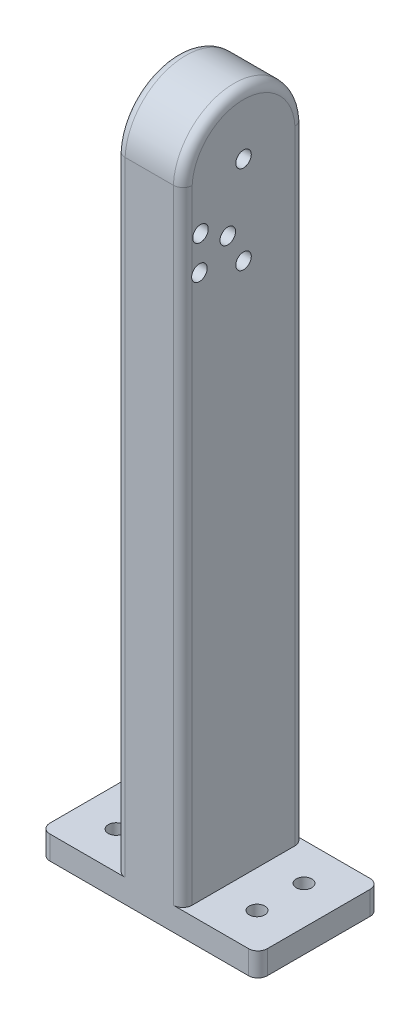
ISO-10303-21;
HEADER;
FILE_DESCRIPTION(('STEP AP214'),'2;1');
FILE_NAME('part.step','',(''),(''),'','','');
FILE_SCHEMA(('AUTOMOTIVE_DESIGN { 1 0 10303 214 1 1 1 1 }'));
ENDSEC;
DATA;
#1=APPLICATION_CONTEXT('core data for automotive mechanical design processes');
#2=APPLICATION_PROTOCOL_DEFINITION('international standard','automotive_design',2000,#1);
#3=PRODUCT_CONTEXT('',#1,'mechanical');
#4=PRODUCT('Part','Part','',(#3));
#5=PRODUCT_RELATED_PRODUCT_CATEGORY('part','',(#4));
#6=PRODUCT_DEFINITION_FORMATION('','',#4);
#7=PRODUCT_DEFINITION_CONTEXT('part definition',#1,'design');
#8=PRODUCT_DEFINITION('design','',#6,#7);
#9=PRODUCT_DEFINITION_SHAPE('','',#8);
#10=(LENGTH_UNIT() NAMED_UNIT(*) SI_UNIT(.MILLI.,.METRE.));
#11=(NAMED_UNIT(*) PLANE_ANGLE_UNIT() SI_UNIT($,.RADIAN.));
#12=(NAMED_UNIT(*) SI_UNIT($,.STERADIAN.) SOLID_ANGLE_UNIT());
#13=UNCERTAINTY_MEASURE_WITH_UNIT(LENGTH_MEASURE(1.E-05),#10,'distance_accuracy_value','');
#14=(GEOMETRIC_REPRESENTATION_CONTEXT(3) GLOBAL_UNCERTAINTY_ASSIGNED_CONTEXT((#13)) GLOBAL_UNIT_ASSIGNED_CONTEXT((#10,
#11,#12)) REPRESENTATION_CONTEXT('',''));
#15=CARTESIAN_POINT('',(0.,0.,0.));
#16=DIRECTION('',(0.,0.,1.));
#17=DIRECTION('',(1.,0.,0.));
#18=AXIS2_PLACEMENT_3D('',#15,#16,#17);
#19=CARTESIAN_POINT('',(-23.135,-31.95,9.56508032957828));
#20=DIRECTION('',(1.,0.,0.));
#21=DIRECTION('',(0.,0.,-1.));
#22=AXIS2_PLACEMENT_3D('',#19,#20,#21);
#23=CYLINDRICAL_SURFACE('',#22,12.95);
#24=DIRECTION('',(1.,0.,0.));
#25=VECTOR('',#24,1.);
#26=CARTESIAN_POINT('',(-23.135,-31.3252175420697,-3.36983934084343));
#27=LINE('',#26,#25);
#28=CARTESIAN_POINT('',(-5.135,-31.3252175420697,-3.36983934084343));
#29=VERTEX_POINT('',#28);
#30=CARTESIAN_POINT('',(5.135,-31.3252175420697,-3.36983934084343));
#31=VERTEX_POINT('',#30);
#32=EDGE_CURVE('E233',#29,#31,#27,.T.);
#33=ORIENTED_EDGE('',*,*,#32,.F.);
#34=CARTESIAN_POINT('',(-5.135,-31.95,9.56508032957828));
#35=DIRECTION('',(-1.,0.,0.));
#36=DIRECTION('',(0.,0.,1.));
#37=AXIS2_PLACEMENT_3D('',#34,#35,#36);
#38=CIRCLE('',#37,12.95);
#39=CARTESIAN_POINT('',(-5.135,-31.3252175420698,22.5));
#40=VERTEX_POINT('',#39);
#41=EDGE_CURVE('E446',#29,#40,#38,.F.);
#42=ORIENTED_EDGE('',*,*,#41,.T.);
#43=DIRECTION('',(1.,0.,0.));
#44=VECTOR('',#43,1.);
#45=CARTESIAN_POINT('',(-23.135,-31.3252175420698,22.5));
#46=LINE('',#45,#44);
#47=CARTESIAN_POINT('',(5.135,-31.3252175420698,22.5));
#48=VERTEX_POINT('',#47);
#49=EDGE_CURVE('E230',#40,#48,#46,.T.);
#50=ORIENTED_EDGE('',*,*,#49,.T.);
#51=CARTESIAN_POINT('',(5.135,-31.95,9.56508032957828));
#52=DIRECTION('',(-1.,0.,0.));
#53=DIRECTION('',(0.,0.,1.));
#54=AXIS2_PLACEMENT_3D('',#51,#52,#53);
#55=CIRCLE('',#54,12.95);
#56=EDGE_CURVE('E390',#48,#31,#55,.T.);
#57=ORIENTED_EDGE('',*,*,#56,.T.);
#58=EDGE_LOOP('',(#33,#42,#50,#57));
#59=FACE_BOUND('',#58,.T.);
#60=ADVANCED_FACE('F39',(#59),#23,.T.);
#61=CARTESIAN_POINT('',(-23.135,-169.,22.5));
#62=DIRECTION('',(0.,-1.,0.));
#63=DIRECTION('',(0.,0.,-1.));
#64=AXIS2_PLACEMENT_3D('',#61,#62,#63);
#65=PLANE('',#64);
#66=CARTESIAN_POINT('',(15.,-169.,4.56690316185003));
#67=DIRECTION('',(0.,1.,0.));
#68=DIRECTION('',(0.,0.,-1.));
#69=AXIS2_PLACEMENT_3D('',#66,#67,#68);
#70=CIRCLE('',#69,1.65);
#71=CARTESIAN_POINT('',(15.,-169.,2.91690316185003));
#72=VERTEX_POINT('',#71);
#73=EDGE_CURVE('E403',#72,#72,#70,.T.);
#74=ORIENTED_EDGE('',*,*,#73,.T.);
#75=EDGE_LOOP('',(#74));
#76=FACE_BOUND('',#75,.T.);
#77=CARTESIAN_POINT('',(15.,-169.,14.5632574973065));
#78=DIRECTION('',(0.,1.,0.));
#79=DIRECTION('',(0.,0.,1.));
#80=AXIS2_PLACEMENT_3D('',#77,#78,#79);
#81=CIRCLE('',#80,1.65);
#82=CARTESIAN_POINT('',(15.,-169.,16.2132574973065));
#83=VERTEX_POINT('',#82);
#84=EDGE_CURVE('E714',#83,#83,#81,.T.);
#85=ORIENTED_EDGE('',*,*,#84,.T.);
#86=EDGE_LOOP('',(#85));
#87=FACE_BOUND('',#86,.T.);
#88=CARTESIAN_POINT('',(-15.,-169.,14.5632574973065));
#89=DIRECTION('',(0.,1.,0.));
#90=DIRECTION('',(0.,0.,-1.));
#91=AXIS2_PLACEMENT_3D('',#88,#89,#90);
#92=CIRCLE('',#91,1.65);
#93=CARTESIAN_POINT('',(-15.,-169.,12.9132574973065));
#94=VERTEX_POINT('',#93);
#95=EDGE_CURVE('E705',#94,#94,#92,.T.);
#96=ORIENTED_EDGE('',*,*,#95,.T.);
#97=EDGE_LOOP('',(#96));
#98=FACE_BOUND('',#97,.T.);
#99=CARTESIAN_POINT('',(-15.,-169.,4.56690316185003));
#100=DIRECTION('',(0.,1.,0.));
#101=DIRECTION('',(0.,0.,1.));
#102=AXIS2_PLACEMENT_3D('',#99,#100,#101);
#103=CIRCLE('',#102,1.65);
#104=CARTESIAN_POINT('',(-15.,-169.,6.21690316185003));
#105=VERTEX_POINT('',#104);
#106=EDGE_CURVE('E392',#105,#105,#103,.T.);
#107=ORIENTED_EDGE('',*,*,#106,.T.);
#108=EDGE_LOOP('',(#107));
#109=FACE_BOUND('',#108,.T.);
#110=DIRECTION('',(1.,0.,0.));
#111=VECTOR('',#110,1.);
#112=CARTESIAN_POINT('',(-23.135,-169.,-3.36983934084343));
#113=LINE('',#112,#111);
#114=CARTESIAN_POINT('',(-21.135,-169.,-3.36983934084343));
#115=VERTEX_POINT('',#114);
#116=CARTESIAN_POINT('',(21.135,-169.,-3.36983934084343));
#117=VERTEX_POINT('',#116);
#118=EDGE_CURVE('E225',#115,#117,#113,.T.);
#119=ORIENTED_EDGE('',*,*,#118,.T.);
#120=CARTESIAN_POINT('',(21.135,-169.,-1.36983934084343));
#121=DIRECTION('',(0.,-1.,0.));
#122=DIRECTION('',(0.,0.,-1.));
#123=AXIS2_PLACEMENT_3D('',#120,#121,#122);
#124=CIRCLE('',#123,2.);
#125=CARTESIAN_POINT('',(23.135,-169.,-1.36983934084343));
#126=VERTEX_POINT('',#125);
#127=EDGE_CURVE('E254',#117,#126,#124,.T.);
#128=ORIENTED_EDGE('',*,*,#127,.T.);
#129=DIRECTION('',(0.,0.,-1.));
#130=VECTOR('',#129,1.);
#131=CARTESIAN_POINT('',(23.135,-169.,22.5));
#132=LINE('',#131,#130);
#133=CARTESIAN_POINT('',(23.135,-169.,20.5));
#134=VERTEX_POINT('',#133);
#135=EDGE_CURVE('E191',#134,#126,#132,.T.);
#136=ORIENTED_EDGE('',*,*,#135,.F.);
#137=CARTESIAN_POINT('',(21.135,-169.,20.5));
#138=DIRECTION('',(0.,-1.,0.));
#139=DIRECTION('',(0.,0.,-1.));
#140=AXIS2_PLACEMENT_3D('',#137,#138,#139);
#141=CIRCLE('',#140,2.);
#142=CARTESIAN_POINT('',(21.135,-169.,22.5));
#143=VERTEX_POINT('',#142);
#144=EDGE_CURVE('E250',#134,#143,#141,.T.);
#145=ORIENTED_EDGE('',*,*,#144,.T.);
#146=DIRECTION('',(1.,0.,0.));
#147=VECTOR('',#146,1.);
#148=CARTESIAN_POINT('',(-23.135,-169.,22.5));
#149=LINE('',#148,#147);
#150=CARTESIAN_POINT('',(-21.135,-169.,22.5));
#151=VERTEX_POINT('',#150);
#152=EDGE_CURVE('E227',#151,#143,#149,.T.);
#153=ORIENTED_EDGE('',*,*,#152,.F.);
#154=CARTESIAN_POINT('',(-21.135,-169.,20.5));
#155=DIRECTION('',(0.,-1.,0.));
#156=DIRECTION('',(0.,0.,-1.));
#157=AXIS2_PLACEMENT_3D('',#154,#155,#156);
#158=CIRCLE('',#157,2.);
#159=CARTESIAN_POINT('',(-23.135,-169.,20.5));
#160=VERTEX_POINT('',#159);
#161=EDGE_CURVE('E248',#151,#160,#158,.T.);
#162=ORIENTED_EDGE('',*,*,#161,.T.);
#163=DIRECTION('',(0.,0.,-1.));
#164=VECTOR('',#163,1.);
#165=CARTESIAN_POINT('',(-23.135,-169.,22.5));
#166=LINE('',#165,#164);
#167=CARTESIAN_POINT('',(-23.135,-169.,-1.36983934084343));
#168=VERTEX_POINT('',#167);
#169=EDGE_CURVE('E222',#160,#168,#166,.T.);
#170=ORIENTED_EDGE('',*,*,#169,.T.);
#171=CARTESIAN_POINT('',(-21.135,-169.,-1.36983934084343));
#172=DIRECTION('',(0.,-1.,0.));
#173=DIRECTION('',(0.,0.,-1.));
#174=AXIS2_PLACEMENT_3D('',#171,#172,#173);
#175=CIRCLE('',#174,2.);
#176=EDGE_CURVE('E252',#168,#115,#175,.T.);
#177=ORIENTED_EDGE('',*,*,#176,.T.);
#178=EDGE_LOOP('',(#119,#128,#136,#145,#153,#162,#170,#177));
#179=FACE_BOUND('',#178,.T.);
#180=ADVANCED_FACE('F319',(#76,#87,#98,#109,#179),#65,.T.);
#181=CARTESIAN_POINT('',(-23.135,-31.3252175420698,22.5));
#182=DIRECTION('',(0.,0.,1.));
#183=DIRECTION('',(1.,0.,0.));
#184=AXIS2_PLACEMENT_3D('',#181,#182,#183);
#185=PLANE('',#184);
#186=ORIENTED_EDGE('',*,*,#49,.F.);
#187=DIRECTION('',(0.,1.,0.));
#188=VECTOR('',#187,1.);
#189=CARTESIAN_POINT('',(-5.135,-31.3252175420698,22.5));
#190=LINE('',#189,#188);
#191=CARTESIAN_POINT('',(-5.135,-164.,22.5));
#192=VERTEX_POINT('',#191);
#193=EDGE_CURVE('E443',#40,#192,#190,.F.);
#194=ORIENTED_EDGE('',*,*,#193,.T.);
#195=DIRECTION('',(-1.,0.,0.));
#196=VECTOR('',#195,1.);
#197=CARTESIAN_POINT('',(-7.135,-164.,22.5));
#198=LINE('',#197,#196);
#199=CARTESIAN_POINT('',(-21.135,-164.,22.5));
#200=VERTEX_POINT('',#199);
#201=EDGE_CURVE('E217',#192,#200,#198,.T.);
#202=ORIENTED_EDGE('',*,*,#201,.T.);
#203=DIRECTION('',(0.,-1.,0.));
#204=VECTOR('',#203,1.);
#205=CARTESIAN_POINT('',(-21.135,-169.,22.5));
#206=LINE('',#205,#204);
#207=EDGE_CURVE('E479',#200,#151,#206,.T.);
#208=ORIENTED_EDGE('',*,*,#207,.T.);
#209=ORIENTED_EDGE('',*,*,#152,.T.);
#210=DIRECTION('',(0.,-1.,0.));
#211=VECTOR('',#210,1.);
#212=CARTESIAN_POINT('',(21.135,-31.3252175420698,22.5));
#213=LINE('',#212,#211);
#214=CARTESIAN_POINT('',(21.135,-164.,22.5));
#215=VERTEX_POINT('',#214);
#216=EDGE_CURVE('E478',#143,#215,#213,.F.);
#217=ORIENTED_EDGE('',*,*,#216,.T.);
#218=DIRECTION('',(-1.,0.,0.));
#219=VECTOR('',#218,1.);
#220=CARTESIAN_POINT('',(23.135,-164.,22.5));
#221=LINE('',#220,#219);
#222=CARTESIAN_POINT('',(5.135,-164.,22.5));
#223=VERTEX_POINT('',#222);
#224=EDGE_CURVE('E197',#215,#223,#221,.T.);
#225=ORIENTED_EDGE('',*,*,#224,.T.);
#226=DIRECTION('',(0.,-1.,0.));
#227=VECTOR('',#226,1.);
#228=CARTESIAN_POINT('',(5.135,-31.3252175420698,22.5));
#229=LINE('',#228,#227);
#230=EDGE_CURVE('E476',#223,#48,#229,.F.);
#231=ORIENTED_EDGE('',*,*,#230,.T.);
#232=EDGE_LOOP('',(#186,#194,#202,#208,#209,#217,#225,#231));
#233=FACE_BOUND('',#232,.T.);
#234=ADVANCED_FACE('F316',(#233),#185,.T.);
#235=CARTESIAN_POINT('',(-23.135,-169.,-3.36983934084343));
#236=DIRECTION('',(0.,0.,-1.));
#237=DIRECTION('',(-1.,0.,0.));
#238=AXIS2_PLACEMENT_3D('',#235,#236,#237);
#239=PLANE('',#238);
#240=DIRECTION('',(1.,0.,0.));
#241=VECTOR('',#240,1.);
#242=CARTESIAN_POINT('',(7.135,-164.,-3.36983934084344));
#243=LINE('',#242,#241);
#244=CARTESIAN_POINT('',(5.135,-164.,-3.36983934084344));
#245=VERTEX_POINT('',#244);
#246=CARTESIAN_POINT('',(21.135,-164.,-3.36983934084344));
#247=VERTEX_POINT('',#246);
#248=EDGE_CURVE('E208',#245,#247,#243,.T.);
#249=ORIENTED_EDGE('',*,*,#248,.T.);
#250=DIRECTION('',(0.,1.,0.));
#251=VECTOR('',#250,1.);
#252=CARTESIAN_POINT('',(21.135,-169.,-3.36983934084343));
#253=LINE('',#252,#251);
#254=EDGE_CURVE('E176',#247,#117,#253,.F.);
#255=ORIENTED_EDGE('',*,*,#254,.T.);
#256=ORIENTED_EDGE('',*,*,#118,.F.);
#257=DIRECTION('',(0.,1.,0.));
#258=VECTOR('',#257,1.);
#259=CARTESIAN_POINT('',(-21.135,-164.,-3.36983934084343));
#260=LINE('',#259,#258);
#261=CARTESIAN_POINT('',(-21.135,-164.,-3.36983934084344));
#262=VERTEX_POINT('',#261);
#263=EDGE_CURVE('E242',#115,#262,#260,.T.);
#264=ORIENTED_EDGE('',*,*,#263,.T.);
#265=DIRECTION('',(-1.,0.,0.));
#266=VECTOR('',#265,1.);
#267=CARTESIAN_POINT('',(-7.135,-164.,-3.36983934084344));
#268=LINE('',#267,#266);
#269=CARTESIAN_POINT('',(-5.135,-164.,-3.36983934084343));
#270=VERTEX_POINT('',#269);
#271=EDGE_CURVE('E214',#270,#262,#268,.T.);
#272=ORIENTED_EDGE('',*,*,#271,.F.);
#273=DIRECTION('',(0.,-1.,0.));
#274=VECTOR('',#273,1.);
#275=CARTESIAN_POINT('',(-5.135,-169.,-3.36983934084343));
#276=LINE('',#275,#274);
#277=EDGE_CURVE('E245',#270,#29,#276,.F.);
#278=ORIENTED_EDGE('',*,*,#277,.T.);
#279=ORIENTED_EDGE('',*,*,#32,.T.);
#280=DIRECTION('',(0.,-1.,0.));
#281=VECTOR('',#280,1.);
#282=CARTESIAN_POINT('',(5.135,-164.,-3.36983934084343));
#283=LINE('',#282,#281);
#284=EDGE_CURVE('E180',#31,#245,#283,.T.);
#285=ORIENTED_EDGE('',*,*,#284,.T.);
#286=EDGE_LOOP('',(#249,#255,#256,#264,#272,#278,#279,#285));
#287=FACE_BOUND('',#286,.T.);
#288=ADVANCED_FACE('F312',(#287),#239,.T.);
#289=CARTESIAN_POINT('',(-23.135,-31.95,9.56508032957828));
#290=DIRECTION('',(1.,0.,0.));
#291=DIRECTION('',(0.,0.,-1.));
#292=AXIS2_PLACEMENT_3D('',#289,#290,#291);
#293=PLANE('',#292);
#294=DIRECTION('',(0.,0.,1.));
#295=VECTOR('',#294,1.);
#296=CARTESIAN_POINT('',(-23.135,-164.,-3.36983934084344));
#297=LINE('',#296,#295);
#298=CARTESIAN_POINT('',(-23.135,-164.,-1.36983934084343));
#299=VERTEX_POINT('',#298);
#300=CARTESIAN_POINT('',(-23.135,-164.,20.5));
#301=VERTEX_POINT('',#300);
#302=EDGE_CURVE('E210',#299,#301,#297,.T.);
#303=ORIENTED_EDGE('',*,*,#302,.F.);
#304=DIRECTION('',(0.,1.,0.));
#305=VECTOR('',#304,1.);
#306=CARTESIAN_POINT('',(-23.135,-169.,-1.36983934084343));
#307=LINE('',#306,#305);
#308=EDGE_CURVE('E465',#299,#168,#307,.F.);
#309=ORIENTED_EDGE('',*,*,#308,.T.);
#310=ORIENTED_EDGE('',*,*,#169,.F.);
#311=DIRECTION('',(0.,-1.,0.));
#312=VECTOR('',#311,1.);
#313=CARTESIAN_POINT('',(-23.135,-164.,20.5));
#314=LINE('',#313,#312);
#315=EDGE_CURVE('E467',#160,#301,#314,.F.);
#316=ORIENTED_EDGE('',*,*,#315,.T.);
#317=EDGE_LOOP('',(#303,#309,#310,#316));
#318=FACE_BOUND('',#317,.T.);
#319=ADVANCED_FACE('F309',(#318),#293,.F.);
#320=CARTESIAN_POINT('',(23.135,-31.95,9.56508032957828));
#321=DIRECTION('',(1.,0.,0.));
#322=DIRECTION('',(0.,0.,-1.));
#323=AXIS2_PLACEMENT_3D('',#320,#321,#322);
#324=PLANE('',#323);
#325=ORIENTED_EDGE('',*,*,#135,.T.);
#326=DIRECTION('',(0.,1.,0.));
#327=VECTOR('',#326,1.);
#328=CARTESIAN_POINT('',(23.135,-31.95,-1.36983934084343));
#329=LINE('',#328,#327);
#330=CARTESIAN_POINT('',(23.135,-164.,-1.36983934084343));
#331=VERTEX_POINT('',#330);
#332=EDGE_CURVE('E175',#126,#331,#329,.T.);
#333=ORIENTED_EDGE('',*,*,#332,.T.);
#334=DIRECTION('',(0.,0.,1.));
#335=VECTOR('',#334,1.);
#336=CARTESIAN_POINT('',(23.135,-164.,-3.36983934084344));
#337=LINE('',#336,#335);
#338=CARTESIAN_POINT('',(23.135,-164.,20.5));
#339=VERTEX_POINT('',#338);
#340=EDGE_CURVE('E188',#331,#339,#337,.T.);
#341=ORIENTED_EDGE('',*,*,#340,.T.);
#342=DIRECTION('',(0.,-1.,0.));
#343=VECTOR('',#342,1.);
#344=CARTESIAN_POINT('',(23.135,-31.95,20.5));
#345=LINE('',#344,#343);
#346=EDGE_CURVE('E192',#339,#134,#345,.T.);
#347=ORIENTED_EDGE('',*,*,#346,.T.);
#348=EDGE_LOOP('',(#325,#333,#341,#347));
#349=FACE_BOUND('',#348,.T.);
#350=ADVANCED_FACE('F186',(#349),#324,.T.);
#351=CARTESIAN_POINT('',(-7.135,-164.,-3.36983934084344));
#352=DIRECTION('',(0.,-1.,0.));
#353=DIRECTION('',(0.,0.,-1.));
#354=AXIS2_PLACEMENT_3D('',#351,#352,#353);
#355=PLANE('',#354);
#356=CARTESIAN_POINT('',(-15.,-164.,14.5632574973065));
#357=DIRECTION('',(0.,1.,0.));
#358=DIRECTION('',(0.,0.,-1.));
#359=AXIS2_PLACEMENT_3D('',#356,#357,#358);
#360=CIRCLE('',#359,1.65);
#361=CARTESIAN_POINT('',(-15.,-164.,12.9132574973065));
#362=VERTEX_POINT('',#361);
#363=EDGE_CURVE('E400',#362,#362,#360,.T.);
#364=ORIENTED_EDGE('',*,*,#363,.F.);
#365=EDGE_LOOP('',(#364));
#366=FACE_BOUND('',#365,.T.);
#367=CARTESIAN_POINT('',(-15.,-164.,4.56690316185003));
#368=DIRECTION('',(0.,1.,0.));
#369=DIRECTION('',(0.,0.,1.));
#370=AXIS2_PLACEMENT_3D('',#367,#368,#369);
#371=CIRCLE('',#370,1.65);
#372=CARTESIAN_POINT('',(-15.,-164.,6.21690316185003));
#373=VERTEX_POINT('',#372);
#374=EDGE_CURVE('E395',#373,#373,#371,.T.);
#375=ORIENTED_EDGE('',*,*,#374,.F.);
#376=EDGE_LOOP('',(#375));
#377=FACE_BOUND('',#376,.T.);
#378=ORIENTED_EDGE('',*,*,#271,.T.);
#379=CARTESIAN_POINT('',(-21.135,-164.,-1.36983934084343));
#380=DIRECTION('',(0.,-1.,0.));
#381=DIRECTION('',(0.,0.,-1.));
#382=AXIS2_PLACEMENT_3D('',#379,#380,#381);
#383=CIRCLE('',#382,2.);
#384=EDGE_CURVE('E469',#262,#299,#383,.F.);
#385=ORIENTED_EDGE('',*,*,#384,.T.);
#386=ORIENTED_EDGE('',*,*,#302,.T.);
#387=CARTESIAN_POINT('',(-21.135,-164.,20.5));
#388=DIRECTION('',(0.,-1.,0.));
#389=DIRECTION('',(0.,0.,-1.));
#390=AXIS2_PLACEMENT_3D('',#387,#388,#389);
#391=CIRCLE('',#390,2.);
#392=EDGE_CURVE('E471',#301,#200,#391,.F.);
#393=ORIENTED_EDGE('',*,*,#392,.T.);
#394=ORIENTED_EDGE('',*,*,#201,.F.);
#395=CARTESIAN_POINT('',(-5.135,-164.,20.5));
#396=DIRECTION('',(0.,-1.,0.));
#397=DIRECTION('',(0.,0.,-1.));
#398=AXIS2_PLACEMENT_3D('',#395,#396,#397);
#399=CIRCLE('',#398,2.);
#400=CARTESIAN_POINT('',(-7.135,-164.,20.5));
#401=VERTEX_POINT('',#400);
#402=EDGE_CURVE('E455',#192,#401,#399,.T.);
#403=ORIENTED_EDGE('',*,*,#402,.T.);
#404=DIRECTION('',(0.,0.,1.));
#405=VECTOR('',#404,1.);
#406=CARTESIAN_POINT('',(-7.135,-164.,-3.36983934084344));
#407=LINE('',#406,#405);
#408=CARTESIAN_POINT('',(-7.135,-164.,-1.36983934084343));
#409=VERTEX_POINT('',#408);
#410=EDGE_CURVE('E211',#409,#401,#407,.T.);
#411=ORIENTED_EDGE('',*,*,#410,.F.);
#412=CARTESIAN_POINT('',(-5.135,-164.,-1.36983934084343));
#413=DIRECTION('',(0.,-1.,0.));
#414=DIRECTION('',(0.,0.,-1.));
#415=AXIS2_PLACEMENT_3D('',#412,#413,#414);
#416=CIRCLE('',#415,2.);
#417=EDGE_CURVE('E453',#409,#270,#416,.T.);
#418=ORIENTED_EDGE('',*,*,#417,.T.);
#419=EDGE_LOOP('',(#378,#385,#386,#393,#394,#403,#411,#418));
#420=FACE_BOUND('',#419,.T.);
#421=ADVANCED_FACE('F304',(#366,#377,#420),#355,.F.);
#422=CARTESIAN_POINT('',(-7.135,-31.95,9.56508032957828));
#423=DIRECTION('',(-1.,0.,0.));
#424=DIRECTION('',(0.,0.,1.));
#425=AXIS2_PLACEMENT_3D('',#422,#423,#424);
#426=PLANE('',#425);
#427=CARTESIAN_POINT('',(-7.135,-31.95,9.56508032957828));
#428=DIRECTION('',(-1.,0.,0.));
#429=DIRECTION('',(0.,0.,1.));
#430=AXIS2_PLACEMENT_3D('',#427,#428,#429);
#431=CIRCLE('',#430,1.64999999999998);
#432=CARTESIAN_POINT('',(-7.135,-31.95,11.2150803295783));
#433=VERTEX_POINT('',#432);
#434=EDGE_CURVE('E408',#433,#433,#431,.T.);
#435=ORIENTED_EDGE('',*,*,#434,.F.);
#436=EDGE_LOOP('',(#435));
#437=FACE_BOUND('',#436,.T.);
#438=CARTESIAN_POINT('',(-7.135,-44.4587394504435,12.9167869636559));
#439=DIRECTION('',(-1.,0.,0.));
#440=DIRECTION('',(0.,0.,1.));
#441=AXIS2_PLACEMENT_3D('',#438,#439,#440);
#442=CIRCLE('',#441,1.64999999999998);
#443=CARTESIAN_POINT('',(-7.135,-44.4587394504435,14.5667869636559));
#444=VERTEX_POINT('',#443);
#445=EDGE_CURVE('E414',#444,#444,#442,.T.);
#446=ORIENTED_EDGE('',*,*,#445,.F.);
#447=EDGE_LOOP('',(#446));
#448=FACE_BOUND('',#447,.T.);
#449=CARTESIAN_POINT('',(-7.135,-50.725,9.5650803295783));
#450=DIRECTION('',(-1.,0.,0.));
#451=DIRECTION('',(0.,0.,1.));
#452=AXIS2_PLACEMENT_3D('',#449,#450,#451);
#453=CIRCLE('',#452,1.64999999999998);
#454=CARTESIAN_POINT('',(-7.135,-50.725,11.2150803295783));
#455=VERTEX_POINT('',#454);
#456=EDGE_CURVE('E420',#455,#455,#453,.T.);
#457=ORIENTED_EDGE('',*,*,#456,.F.);
#458=EDGE_LOOP('',(#457));
#459=FACE_BOUND('',#458,.T.);
#460=ORIENTED_EDGE('',*,*,#410,.T.);
#461=DIRECTION('',(0.,1.,0.));
#462=VECTOR('',#461,1.);
#463=CARTESIAN_POINT('',(-7.135,-31.95,20.5));
#464=LINE('',#463,#462);
#465=CARTESIAN_POINT('',(-7.135,-48.7823331316716,20.5));
#466=VERTEX_POINT('',#465);
#467=EDGE_CURVE('E262',#401,#466,#464,.T.);
#468=ORIENTED_EDGE('',*,*,#467,.T.);
#469=CARTESIAN_POINT('',(-7.135,-48.2096269560528,18.9525803295783));
#470=DIRECTION('',(-1.,0.,0.));
#471=DIRECTION('',(0.,0.,1.));
#472=AXIS2_PLACEMENT_3D('',#469,#470,#471);
#473=CIRCLE('',#472,1.64999999999998);
#474=CARTESIAN_POINT('',(-7.135,-47.636920780434,20.5));
#475=VERTEX_POINT('',#474);
#476=EDGE_CURVE('E426',#475,#466,#473,.T.);
#477=ORIENTED_EDGE('',*,*,#476,.F.);
#478=DIRECTION('',(0.,1.,0.));
#479=VECTOR('',#478,1.);
#480=CARTESIAN_POINT('',(-7.135,-31.95,20.5));
#481=LINE('',#480,#479);
#482=CARTESIAN_POINT('',(-7.135,-31.375516056416,20.4999999999995));
#483=VERTEX_POINT('',#482);
#484=EDGE_CURVE('E260',#475,#483,#481,.T.);
#485=ORIENTED_EDGE('',*,*,#484,.T.);
#486=CARTESIAN_POINT('',(-7.135,-31.95,9.56508032957828));
#487=DIRECTION('',(-1.,0.,0.));
#488=DIRECTION('',(0.,0.,1.));
#489=AXIS2_PLACEMENT_3D('',#486,#487,#488);
#490=CIRCLE('',#489,10.95);
#491=CARTESIAN_POINT('',(-7.135,-31.3755160564159,-1.3698393408429));
#492=VERTEX_POINT('',#491);
#493=EDGE_CURVE('E256',#483,#492,#490,.T.);
#494=ORIENTED_EDGE('',*,*,#493,.T.);
#495=DIRECTION('',(0.,-1.,0.));
#496=VECTOR('',#495,1.);
#497=CARTESIAN_POINT('',(-7.135,-31.95,-1.36983934084343));
#498=LINE('',#497,#496);
#499=EDGE_CURVE('E258',#492,#409,#498,.T.);
#500=ORIENTED_EDGE('',*,*,#499,.T.);
#501=EDGE_LOOP('',(#460,#468,#477,#485,#494,#500));
#502=FACE_BOUND('',#501,.T.);
#503=CARTESIAN_POINT('',(-7.135,-41.1070328163658,18.722113145944));
#504=DIRECTION('',(-1.,0.,0.));
#505=DIRECTION('',(0.,0.,1.));
#506=AXIS2_PLACEMENT_3D('',#503,#504,#505);
#507=CIRCLE('',#506,1.64999999999998);
#508=CARTESIAN_POINT('',(-7.135,-41.1070328163658,20.372113145944));
#509=VERTEX_POINT('',#508);
#510=EDGE_CURVE('E198',#509,#509,#507,.T.);
#511=ORIENTED_EDGE('',*,*,#510,.F.);
#512=EDGE_LOOP('',(#511));
#513=FACE_BOUND('',#512,.T.);
#514=ADVANCED_FACE('F300',(#437,#448,#459,#502,#513),#426,.T.);
#515=CARTESIAN_POINT('',(7.135,-19.,22.5));
#516=DIRECTION('',(-1.,0.,0.));
#517=DIRECTION('',(0.,0.,1.));
#518=AXIS2_PLACEMENT_3D('',#515,#516,#517);
#519=PLANE('',#518);
#520=CARTESIAN_POINT('',(7.135,-31.95,9.56508032957828));
#521=DIRECTION('',(1.,0.,0.));
#522=DIRECTION('',(0.,0.,-1.));
#523=AXIS2_PLACEMENT_3D('',#520,#521,#522);
#524=CIRCLE('',#523,1.64999999999998);
#525=CARTESIAN_POINT('',(7.135,-31.95,7.91508032957829));
#526=VERTEX_POINT('',#525);
#527=EDGE_CURVE('E358',#526,#526,#524,.T.);
#528=ORIENTED_EDGE('',*,*,#527,.F.);
#529=EDGE_LOOP('',(#528));
#530=FACE_BOUND('',#529,.T.);
#531=CARTESIAN_POINT('',(7.135,-44.4587394504435,12.9167869636559));
#532=DIRECTION('',(1.,0.,0.));
#533=DIRECTION('',(0.,0.,-1.));
#534=AXIS2_PLACEMENT_3D('',#531,#532,#533);
#535=CIRCLE('',#534,1.64999999999998);
#536=CARTESIAN_POINT('',(7.135,-44.4587394504435,11.2667869636559));
#537=VERTEX_POINT('',#536);
#538=EDGE_CURVE('E411',#537,#537,#535,.T.);
#539=ORIENTED_EDGE('',*,*,#538,.F.);
#540=EDGE_LOOP('',(#539));
#541=FACE_BOUND('',#540,.T.);
#542=CARTESIAN_POINT('',(7.135,-50.725,9.5650803295783));
#543=DIRECTION('',(1.,0.,0.));
#544=DIRECTION('',(0.,0.,-1.));
#545=AXIS2_PLACEMENT_3D('',#542,#543,#544);
#546=CIRCLE('',#545,1.64999999999998);
#547=CARTESIAN_POINT('',(7.135,-50.725,7.91508032957832));
#548=VERTEX_POINT('',#547);
#549=EDGE_CURVE('E417',#548,#548,#546,.T.);
#550=ORIENTED_EDGE('',*,*,#549,.F.);
#551=EDGE_LOOP('',(#550));
#552=FACE_BOUND('',#551,.T.);
#553=DIRECTION('',(0.,0.,-1.));
#554=VECTOR('',#553,1.);
#555=CARTESIAN_POINT('',(7.135,-164.,22.5));
#556=LINE('',#555,#554);
#557=CARTESIAN_POINT('',(7.135,-164.,20.5));
#558=VERTEX_POINT('',#557);
#559=CARTESIAN_POINT('',(7.135,-164.,-1.36983934084343));
#560=VERTEX_POINT('',#559);
#561=EDGE_CURVE('E200',#558,#560,#556,.T.);
#562=ORIENTED_EDGE('',*,*,#561,.T.);
#563=DIRECTION('',(0.,-1.,0.));
#564=VECTOR('',#563,1.);
#565=CARTESIAN_POINT('',(7.135,-31.3252175420697,-1.36983934084343));
#566=LINE('',#565,#564);
#567=CARTESIAN_POINT('',(7.135,-31.3755160564159,-1.3698393408429));
#568=VERTEX_POINT('',#567);
#569=EDGE_CURVE('E62',#560,#568,#566,.F.);
#570=ORIENTED_EDGE('',*,*,#569,.T.);
#571=CARTESIAN_POINT('',(7.135,-31.95,9.56508032957828));
#572=DIRECTION('',(-1.,0.,0.));
#573=DIRECTION('',(0.,0.,1.));
#574=AXIS2_PLACEMENT_3D('',#571,#572,#573);
#575=CIRCLE('',#574,10.95);
#576=CARTESIAN_POINT('',(7.135,-31.375516056416,20.5));
#577=VERTEX_POINT('',#576);
#578=EDGE_CURVE('E66',#568,#577,#575,.F.);
#579=ORIENTED_EDGE('',*,*,#578,.T.);
#580=DIRECTION('',(0.,-1.,0.));
#581=VECTOR('',#580,1.);
#582=CARTESIAN_POINT('',(7.135,-164.,20.5));
#583=LINE('',#582,#581);
#584=CARTESIAN_POINT('',(7.135,-47.636920780434,20.5));
#585=VERTEX_POINT('',#584);
#586=EDGE_CURVE('E461',#577,#585,#583,.T.);
#587=ORIENTED_EDGE('',*,*,#586,.T.);
#588=CARTESIAN_POINT('',(7.135,-48.2096269560528,18.9525803295783));
#589=DIRECTION('',(1.,0.,0.));
#590=DIRECTION('',(0.,0.,-1.));
#591=AXIS2_PLACEMENT_3D('',#588,#589,#590);
#592=CIRCLE('',#591,1.64999999999998);
#593=CARTESIAN_POINT('',(7.135,-48.7823331316716,20.5));
#594=VERTEX_POINT('',#593);
#595=EDGE_CURVE('E423',#594,#585,#592,.T.);
#596=ORIENTED_EDGE('',*,*,#595,.F.);
#597=DIRECTION('',(0.,-1.,0.));
#598=VECTOR('',#597,1.);
#599=CARTESIAN_POINT('',(7.135,-164.,20.5));
#600=LINE('',#599,#598);
#601=EDGE_CURVE('E463',#594,#558,#600,.T.);
#602=ORIENTED_EDGE('',*,*,#601,.T.);
#603=EDGE_LOOP('',(#562,#570,#579,#587,#596,#602));
#604=FACE_BOUND('',#603,.T.);
#605=CARTESIAN_POINT('',(7.135,-41.1070328163658,18.722113145944));
#606=DIRECTION('',(1.,0.,0.));
#607=DIRECTION('',(0.,0.,-1.));
#608=AXIS2_PLACEMENT_3D('',#605,#606,#607);
#609=CIRCLE('',#608,1.64999999999998);
#610=CARTESIAN_POINT('',(7.135,-41.1070328163658,17.0721131459441));
#611=VERTEX_POINT('',#610);
#612=EDGE_CURVE('E203',#611,#611,#609,.T.);
#613=ORIENTED_EDGE('',*,*,#612,.F.);
#614=EDGE_LOOP('',(#613));
#615=FACE_BOUND('',#614,.T.);
#616=ADVANCED_FACE('F296',(#530,#541,#552,#604,#615),#519,.F.);
#617=CARTESIAN_POINT('',(0.,-164.,0.));
#618=DIRECTION('',(0.,-1.,0.));
#619=DIRECTION('',(0.,0.,-1.));
#620=AXIS2_PLACEMENT_3D('',#617,#618,#619);
#621=PLANE('',#620);
#622=CARTESIAN_POINT('',(15.,-164.,4.56690316185003));
#623=DIRECTION('',(0.,1.,0.));
#624=DIRECTION('',(0.,0.,-1.));
#625=AXIS2_PLACEMENT_3D('',#622,#623,#624);
#626=CIRCLE('',#625,1.65);
#627=CARTESIAN_POINT('',(15.,-164.,2.91690316185003));
#628=VERTEX_POINT('',#627);
#629=EDGE_CURVE('E716',#628,#628,#626,.T.);
#630=ORIENTED_EDGE('',*,*,#629,.F.);
#631=EDGE_LOOP('',(#630));
#632=FACE_BOUND('',#631,.T.);
#633=CARTESIAN_POINT('',(15.,-164.,14.5632574973065));
#634=DIRECTION('',(0.,1.,0.));
#635=DIRECTION('',(0.,0.,1.));
#636=AXIS2_PLACEMENT_3D('',#633,#634,#635);
#637=CIRCLE('',#636,1.65);
#638=CARTESIAN_POINT('',(15.,-164.,16.2132574973065));
#639=VERTEX_POINT('',#638);
#640=EDGE_CURVE('E709',#639,#639,#637,.T.);
#641=ORIENTED_EDGE('',*,*,#640,.F.);
#642=EDGE_LOOP('',(#641));
#643=FACE_BOUND('',#642,.T.);
#644=ORIENTED_EDGE('',*,*,#340,.F.);
#645=CARTESIAN_POINT('',(21.135,-164.,-1.36983934084343));
#646=DIRECTION('',(0.,-1.,0.));
#647=DIRECTION('',(0.,0.,-1.));
#648=AXIS2_PLACEMENT_3D('',#645,#646,#647);
#649=CIRCLE('',#648,2.);
#650=EDGE_CURVE('E171',#331,#247,#649,.F.);
#651=ORIENTED_EDGE('',*,*,#650,.T.);
#652=ORIENTED_EDGE('',*,*,#248,.F.);
#653=CARTESIAN_POINT('',(5.135,-164.,-1.36983934084343));
#654=DIRECTION('',(0.,-1.,0.));
#655=DIRECTION('',(0.,0.,-1.));
#656=AXIS2_PLACEMENT_3D('',#653,#654,#655);
#657=CIRCLE('',#656,2.);
#658=EDGE_CURVE('E54',#245,#560,#657,.T.);
#659=ORIENTED_EDGE('',*,*,#658,.T.);
#660=ORIENTED_EDGE('',*,*,#561,.F.);
#661=CARTESIAN_POINT('',(5.135,-164.,20.5));
#662=DIRECTION('',(0.,-1.,0.));
#663=DIRECTION('',(0.,0.,-1.));
#664=AXIS2_PLACEMENT_3D('',#661,#662,#663);
#665=CIRCLE('',#664,2.);
#666=EDGE_CURVE('E11',#558,#223,#665,.T.);
#667=ORIENTED_EDGE('',*,*,#666,.T.);
#668=ORIENTED_EDGE('',*,*,#224,.F.);
#669=CARTESIAN_POINT('',(21.135,-164.,20.5));
#670=DIRECTION('',(0.,-1.,0.));
#671=DIRECTION('',(0.,0.,-1.));
#672=AXIS2_PLACEMENT_3D('',#669,#670,#671);
#673=CIRCLE('',#672,2.);
#674=EDGE_CURVE('E181',#215,#339,#673,.F.);
#675=ORIENTED_EDGE('',*,*,#674,.T.);
#676=EDGE_LOOP('',(#644,#651,#652,#659,#660,#667,#668,#675));
#677=FACE_BOUND('',#676,.T.);
#678=ADVANCED_FACE('F194',(#632,#643,#677),#621,.F.);
#679=CARTESIAN_POINT('',(7.135,-41.1070328163658,18.722113145944));
#680=DIRECTION('',(1.,0.,0.));
#681=DIRECTION('',(0.,0.,-1.));
#682=AXIS2_PLACEMENT_3D('',#679,#680,#681);
#683=CYLINDRICAL_SURFACE('',#682,1.64999999999998);
#684=ORIENTED_EDGE('',*,*,#510,.T.);
#685=EDGE_LOOP('',(#684));
#686=FACE_BOUND('',#685,.T.);
#687=ORIENTED_EDGE('',*,*,#612,.T.);
#688=EDGE_LOOP('',(#687));
#689=FACE_BOUND('',#688,.T.);
#690=ADVANCED_FACE('F287',(#686,#689),#683,.F.);
#691=CARTESIAN_POINT('',(7.135,-48.2096269560528,18.9525803295783));
#692=DIRECTION('',(1.,0.,0.));
#693=DIRECTION('',(0.,0.,-1.));
#694=AXIS2_PLACEMENT_3D('',#691,#692,#693);
#695=CYLINDRICAL_SURFACE('',#694,1.64999999999998);
#696=ORIENTED_EDGE('',*,*,#476,.T.);
#697=CARTESIAN_POINT('',(-7.135,-48.7823331316716,20.5));
#698=CARTESIAN_POINT('',(-7.13499276726961,-48.738175588663,20.5163406054063));
#699=CARTESIAN_POINT('',(-7.13480108782915,-48.6933477168429,20.5307829410772));
#700=CARTESIAN_POINT('',(-7.13426204038727,-48.6026298654884,20.5557855204151));
#701=CARTESIAN_POINT('',(-7.13391469439208,-48.5567400369499,20.5663463124234));
#702=CARTESIAN_POINT('',(-7.1329777472706,-48.4206362914454,20.5915726588916));
#703=CARTESIAN_POINT('',(-7.13246749433423,-48.3293216199519,20.600759304645));
#704=CARTESIAN_POINT('',(-7.1323319700304,-48.1877035906192,20.6032049443742));
#705=CARTESIAN_POINT('',(-7.13241201286143,-48.1374141921673,20.6017669536591));
#706=CARTESIAN_POINT('',(-7.13277934193565,-48.037151884116,20.5943096663883));
#707=CARTESIAN_POINT('',(-7.13306666034399,-47.9871790248516,20.5882896587844));
#708=CARTESIAN_POINT('',(-7.1337429987089,-47.8863661946136,20.5714377533701));
#709=CARTESIAN_POINT('',(-7.13413504952428,-47.8355516662867,20.5604542805068));
#710=CARTESIAN_POINT('',(-7.13475544731526,-47.7351807910954,20.533751900601));
#711=CARTESIAN_POINT('',(-7.13498379147648,-47.6856244658755,20.518032912154));
#712=CARTESIAN_POINT('',(-7.135,-47.636920780434,20.5));
#713=B_SPLINE_CURVE_WITH_KNOTS('',3,(#697,#698,#699,#700,#701,#702,#703,#704,#705,#706,#707,
#708,#709,#710,#711,#712),.UNSPECIFIED.,.F.,.F.,(4,2,2,2,2,2,2,4),(0.,0.141149153873634,
0.282278360094851,0.556121603587256,0.706883024521765,0.857667845741826,1.01340597515184,
1.16914678188301),.UNSPECIFIED.);
#714=EDGE_CURVE('E272',#466,#475,#713,.T.);
#715=ORIENTED_EDGE('',*,*,#714,.T.);
#716=EDGE_LOOP('',(#696,#715));
#717=FACE_BOUND('',#716,.T.);
#718=ORIENTED_EDGE('',*,*,#595,.T.);
#719=CARTESIAN_POINT('',(7.135,-47.636920780434,20.5));
#720=CARTESIAN_POINT('',(7.13499276726962,-47.6810783234426,20.5163406054063));
#721=CARTESIAN_POINT('',(7.13480108782915,-47.7259061952627,20.5307829410772));
#722=CARTESIAN_POINT('',(7.13426204038727,-47.8166240466172,20.5557855204151));
#723=CARTESIAN_POINT('',(7.13391469439208,-47.8625138751557,20.5663463124234));
#724=CARTESIAN_POINT('',(7.1329777472706,-47.9986176206602,20.5915726588916));
#725=CARTESIAN_POINT('',(7.13246749433423,-48.0899322921537,20.600759304645));
#726=CARTESIAN_POINT('',(7.1323319700304,-48.2315503214864,20.6032049443742));
#727=CARTESIAN_POINT('',(7.13241201286143,-48.2818397199383,20.6017669536591));
#728=CARTESIAN_POINT('',(7.13277934193565,-48.3821020279896,20.5943096663883));
#729=CARTESIAN_POINT('',(7.13306666034399,-48.432074887254,20.5882896587844));
#730=CARTESIAN_POINT('',(7.1337429987089,-48.532887717492,20.5714377533701));
#731=CARTESIAN_POINT('',(7.13413504952428,-48.5837022458189,20.5604542805068));
#732=CARTESIAN_POINT('',(7.13475544731526,-48.6840731210102,20.533751900601));
#733=CARTESIAN_POINT('',(7.13498379147648,-48.7336294462301,20.518032912154));
#734=CARTESIAN_POINT('',(7.135,-48.7823331316716,20.5));
#735=B_SPLINE_CURVE_WITH_KNOTS('',3,(#719,#720,#721,#722,#723,#724,#725,#726,#727,#728,#729,
#730,#731,#732,#733,#734),.UNSPECIFIED.,.F.,.F.,(4,2,2,2,2,2,2,4),(0.,0.141149153873627,
0.282278360094851,0.556121603587256,0.706883024521765,0.857667845741826,1.01340597515183,
1.16914678188301),.UNSPECIFIED.);
#736=EDGE_CURVE('E265',#585,#594,#735,.T.);
#737=ORIENTED_EDGE('',*,*,#736,.T.);
#738=EDGE_LOOP('',(#718,#737));
#739=FACE_BOUND('',#738,.T.);
#740=ADVANCED_FACE('F281',(#717,#739),#695,.F.);
#741=CARTESIAN_POINT('',(7.135,-50.725,9.5650803295783));
#742=DIRECTION('',(1.,0.,0.));
#743=DIRECTION('',(0.,0.,-1.));
#744=AXIS2_PLACEMENT_3D('',#741,#742,#743);
#745=CYLINDRICAL_SURFACE('',#744,1.64999999999998);
#746=ORIENTED_EDGE('',*,*,#456,.T.);
#747=EDGE_LOOP('',(#746));
#748=FACE_BOUND('',#747,.T.);
#749=ORIENTED_EDGE('',*,*,#549,.T.);
#750=EDGE_LOOP('',(#749));
#751=FACE_BOUND('',#750,.T.);
#752=ADVANCED_FACE('F286',(#748,#751),#745,.F.);
#753=CARTESIAN_POINT('',(7.135,-44.4587394504435,12.9167869636559));
#754=DIRECTION('',(1.,0.,0.));
#755=DIRECTION('',(0.,0.,-1.));
#756=AXIS2_PLACEMENT_3D('',#753,#754,#755);
#757=CYLINDRICAL_SURFACE('',#756,1.64999999999998);
#758=ORIENTED_EDGE('',*,*,#445,.T.);
#759=EDGE_LOOP('',(#758));
#760=FACE_BOUND('',#759,.T.);
#761=ORIENTED_EDGE('',*,*,#538,.T.);
#762=EDGE_LOOP('',(#761));
#763=FACE_BOUND('',#762,.T.);
#764=ADVANCED_FACE('F570',(#760,#763),#757,.F.);
#765=CARTESIAN_POINT('',(7.135,-31.95,9.56508032957828));
#766=DIRECTION('',(1.,0.,0.));
#767=DIRECTION('',(0.,0.,-1.));
#768=AXIS2_PLACEMENT_3D('',#765,#766,#767);
#769=CYLINDRICAL_SURFACE('',#768,1.64999999999998);
#770=ORIENTED_EDGE('',*,*,#434,.T.);
#771=EDGE_LOOP('',(#770));
#772=FACE_BOUND('',#771,.T.);
#773=ORIENTED_EDGE('',*,*,#527,.T.);
#774=EDGE_LOOP('',(#773));
#775=FACE_BOUND('',#774,.T.);
#776=ADVANCED_FACE('F332',(#772,#775),#769,.F.);
#777=CARTESIAN_POINT('',(21.135,-31.95,-1.36983934084343));
#778=DIRECTION('',(0.,1.,0.));
#779=DIRECTION('',(0.,0.,1.));
#780=AXIS2_PLACEMENT_3D('',#777,#778,#779);
#781=CYLINDRICAL_SURFACE('',#780,2.);
#782=ORIENTED_EDGE('',*,*,#127,.F.);
#783=ORIENTED_EDGE('',*,*,#254,.F.);
#784=ORIENTED_EDGE('',*,*,#650,.F.);
#785=ORIENTED_EDGE('',*,*,#332,.F.);
#786=EDGE_LOOP('',(#782,#783,#784,#785));
#787=FACE_BOUND('',#786,.T.);
#788=ADVANCED_FACE('F174',(#787),#781,.T.);
#789=CARTESIAN_POINT('',(-5.135,-31.95,-1.36983934084343));
#790=DIRECTION('',(0.,-1.,0.));
#791=DIRECTION('',(0.,0.,-1.));
#792=AXIS2_PLACEMENT_3D('',#789,#790,#791);
#793=CYLINDRICAL_SURFACE('',#792,2.);
#794=ORIENTED_EDGE('',*,*,#417,.F.);
#795=ORIENTED_EDGE('',*,*,#499,.F.);
#796=CARTESIAN_POINT('',(-5.135,-31.3252175420697,-3.36983934084343));
#797=CARTESIAN_POINT('',(-5.19125537713052,-31.3252175764603,-3.36983897385474));
#798=CARTESIAN_POINT('',(-5.24748379812947,-31.3252748642065,-3.36746434992817));
#799=CARTESIAN_POINT('',(-5.35953822736624,-31.3255035731182,-3.35799106333982));
#800=CARTESIAN_POINT('',(-5.41536425494015,-31.3256749887621,-3.3508926292202));
#801=CARTESIAN_POINT('',(-5.58154805890456,-31.3263591507087,-3.32257799109261));
#802=CARTESIAN_POINT('',(-5.69079246272558,-31.3270418150633,-3.2943422716682));
#803=CARTESIAN_POINT('',(-5.90298505160856,-31.3288456026779,-3.21993746339676));
#804=CARTESIAN_POINT('',(-6.00593022071361,-31.3299669340932,-3.17375986087798));
#805=CARTESIAN_POINT('',(-6.20259647261973,-31.3326229257142,-3.06479210568851));
#806=CARTESIAN_POINT('',(-6.29631973759982,-31.3341574878144,-3.00200589614521));
#807=CARTESIAN_POINT('',(-6.47189870102334,-31.337605379852,-2.86159734184436));
#808=CARTESIAN_POINT('',(-6.55375358724071,-31.3395187356915,-2.7839739825315));
#809=CARTESIAN_POINT('',(-6.70330015876976,-31.3436807191404,-2.61606368199895));
#810=CARTESIAN_POINT('',(-6.77098689769769,-31.3459294633729,-2.52577233644593));
#811=CARTESIAN_POINT('',(-6.89027415036506,-31.3507090853825,-2.33507312713727));
#812=CARTESIAN_POINT('',(-6.94186537463813,-31.3532401249457,-2.23465946539124));
#813=CARTESIAN_POINT('',(-7.02741223172571,-31.3585201336072,-2.02664506877113));
#814=CARTESIAN_POINT('',(-7.06138440964734,-31.3612688954473,-1.91905118403825));
#815=CARTESIAN_POINT('',(-7.1009108648134,-31.3657825321349,-1.74368266178337));
#816=CARTESIAN_POINT('',(-7.11239633233165,-31.3675015688175,-1.67717978050658));
#817=CARTESIAN_POINT('',(-7.12858801047695,-31.3709749089427,-1.54341821453792));
#818=CARTESIAN_POINT('',(-7.13330419782742,-31.3727291566131,-1.47616078966709));
#819=CARTESIAN_POINT('',(-7.13487327661157,-31.3748332238604,-1.39586334399681));
#820=CARTESIAN_POINT('',(-7.13500033869318,-31.3751745105352,-1.38285043035291));
#821=CARTESIAN_POINT('',(-7.135,-31.3755160564261,-1.36983934084343));
#822=B_SPLINE_CURVE_WITH_KNOTS('',3,(#796,#797,#798,#799,#800,#801,#802,#803,#804,#805,#806,
#807,#808,#809,#810,#811,#812,#813,#814,#815,#816,#817,#818,#819,#820,#821),.UNSPECIFIED.,.F.,
.F.,(4,2,2,2,2,2,2,2,2,2,2,2,4),(0.,0.168662457634864,0.337316755821911,0.674089542110454,
1.01102232729334,1.34787519136399,1.68475109747508,2.02174441826622,2.35893187522639,
2.6958021214864,2.89803772465167,3.09997496111759,3.13902610637464),.UNSPECIFIED.);
#823=EDGE_CURVE('E351',#29,#492,#822,.T.);
#824=ORIENTED_EDGE('',*,*,#823,.F.);
#825=ORIENTED_EDGE('',*,*,#277,.F.);
#826=EDGE_LOOP('',(#794,#795,#824,#825));
#827=FACE_BOUND('',#826,.T.);
#828=ADVANCED_FACE('F331',(#827),#793,.T.);
#829=CARTESIAN_POINT('',(-5.135,-31.95,9.56508032957828));
#830=DIRECTION('',(-1.,0.,0.));
#831=DIRECTION('',(0.,0.,1.));
#832=AXIS2_PLACEMENT_3D('',#829,#830,#831);
#833=TOROIDAL_SURFACE('',#832,10.95,2.);
#834=ORIENTED_EDGE('',*,*,#823,.T.);
#835=ORIENTED_EDGE('',*,*,#493,.F.);
#836=CARTESIAN_POINT('',(-5.135,-31.3252175420698,22.5));
#837=CARTESIAN_POINT('',(-5.19125537713052,-31.3252175764604,22.4999996330113));
#838=CARTESIAN_POINT('',(-5.24748379812947,-31.3252748642065,22.4976250090847));
#839=CARTESIAN_POINT('',(-5.35953822736624,-31.3255035731182,22.4881517224964));
#840=CARTESIAN_POINT('',(-5.41536425494015,-31.3256749887622,22.4810532883768));
#841=CARTESIAN_POINT('',(-5.58154805890456,-31.3263591507088,22.4527386502492));
#842=CARTESIAN_POINT('',(-5.69079246272558,-31.3270418150634,22.4245029308248));
#843=CARTESIAN_POINT('',(-5.90298505160856,-31.3288456026779,22.3500981225533));
#844=CARTESIAN_POINT('',(-6.00593022071362,-31.3299669340933,22.3039205200345));
#845=CARTESIAN_POINT('',(-6.20259647261973,-31.3326229257143,22.1949527648451));
#846=CARTESIAN_POINT('',(-6.29631973759982,-31.3341574878145,22.1321665553018));
#847=CARTESIAN_POINT('',(-6.47189870102334,-31.3376053798521,21.9917580010009));
#848=CARTESIAN_POINT('',(-6.55375358724071,-31.3395187356915,21.9141346416881));
#849=CARTESIAN_POINT('',(-6.70330015876976,-31.3436807191404,21.7462243411555));
#850=CARTESIAN_POINT('',(-6.77098689769769,-31.345929463373,21.6559329956025));
#851=CARTESIAN_POINT('',(-6.89027415036506,-31.3507090853826,21.4652337862938));
#852=CARTESIAN_POINT('',(-6.94186537463813,-31.3532401249458,21.3648201245478));
#853=CARTESIAN_POINT('',(-7.02741223172571,-31.3585201336073,21.1568057279277));
#854=CARTESIAN_POINT('',(-7.06138440964734,-31.3612688954475,21.0492118431948));
#855=CARTESIAN_POINT('',(-7.1009108648134,-31.3657825321349,20.8738433209399));
#856=CARTESIAN_POINT('',(-7.11239633233165,-31.3675015688174,20.8073404396631));
#857=CARTESIAN_POINT('',(-7.12858801047695,-31.3709749089427,20.6735788736945));
#858=CARTESIAN_POINT('',(-7.13330419782742,-31.3727291566133,20.6063214488237));
#859=CARTESIAN_POINT('',(-7.13487327661157,-31.3748332238605,20.5260240031534));
#860=CARTESIAN_POINT('',(-7.13500033869318,-31.3751745105353,20.5130110895095));
#861=CARTESIAN_POINT('',(-7.135,-31.3755160564261,20.5));
#862=B_SPLINE_CURVE_WITH_KNOTS('',3,(#836,#837,#838,#839,#840,#841,#842,#843,#844,#845,#846,
#847,#848,#849,#850,#851,#852,#853,#854,#855,#856,#857,#858,#859,#860,#861),.UNSPECIFIED.,.F.,
.F.,(4,2,2,2,2,2,2,2,2,2,2,2,4),(0.,0.168662457634864,0.337316755821911,0.674089542110455,
1.01102232729334,1.34787519136399,1.68475109747508,2.02174441826622,2.35893187522639,
2.6958021214864,2.89803772465167,3.09997496111759,3.13902610637463),.UNSPECIFIED.);
#863=EDGE_CURVE('E344',#40,#483,#862,.T.);
#864=ORIENTED_EDGE('',*,*,#863,.F.);
#865=ORIENTED_EDGE('',*,*,#41,.F.);
#866=EDGE_LOOP('',(#834,#835,#864,#865));
#867=FACE_BOUND('',#866,.T.);
#868=ADVANCED_FACE('F338',(#867),#833,.T.);
#869=CARTESIAN_POINT('',(-5.135,-31.95,20.5));
#870=DIRECTION('',(0.,1.,0.));
#871=DIRECTION('',(0.,0.,1.));
#872=AXIS2_PLACEMENT_3D('',#869,#870,#871);
#873=CYLINDRICAL_SURFACE('',#872,2.);
#874=ORIENTED_EDGE('',*,*,#402,.F.);
#875=ORIENTED_EDGE('',*,*,#193,.F.);
#876=ORIENTED_EDGE('',*,*,#863,.T.);
#877=ORIENTED_EDGE('',*,*,#484,.F.);
#878=ORIENTED_EDGE('',*,*,#714,.F.);
#879=ORIENTED_EDGE('',*,*,#467,.F.);
#880=EDGE_LOOP('',(#874,#875,#876,#877,#878,#879));
#881=FACE_BOUND('',#880,.T.);
#882=ADVANCED_FACE('F333',(#881),#873,.T.);
#883=CARTESIAN_POINT('',(-21.135,-169.,-1.36983934084343));
#884=DIRECTION('',(0.,-1.,0.));
#885=DIRECTION('',(0.,0.,-1.));
#886=AXIS2_PLACEMENT_3D('',#883,#884,#885);
#887=CYLINDRICAL_SURFACE('',#886,2.);
#888=ORIENTED_EDGE('',*,*,#176,.F.);
#889=ORIENTED_EDGE('',*,*,#308,.F.);
#890=ORIENTED_EDGE('',*,*,#384,.F.);
#891=ORIENTED_EDGE('',*,*,#263,.F.);
#892=EDGE_LOOP('',(#888,#889,#890,#891));
#893=FACE_BOUND('',#892,.T.);
#894=ADVANCED_FACE('F337',(#893),#887,.T.);
#895=CARTESIAN_POINT('',(5.135,-19.,20.5));
#896=DIRECTION('',(0.,1.,0.));
#897=DIRECTION('',(0.,0.,1.));
#898=AXIS2_PLACEMENT_3D('',#895,#896,#897);
#899=CYLINDRICAL_SURFACE('',#898,2.);
#900=ORIENTED_EDGE('',*,*,#736,.F.);
#901=ORIENTED_EDGE('',*,*,#586,.F.);
#902=CARTESIAN_POINT('',(5.135,-31.3252175420698,22.5));
#903=CARTESIAN_POINT('',(5.19125537713052,-31.3252175764604,22.4999996330113));
#904=CARTESIAN_POINT('',(5.24748379812946,-31.3252748642065,22.4976250090847));
#905=CARTESIAN_POINT('',(5.35953822736624,-31.3255035731182,22.4881517224964));
#906=CARTESIAN_POINT('',(5.41536425494015,-31.3256749887622,22.4810532883768));
#907=CARTESIAN_POINT('',(5.58154805890456,-31.3263591507088,22.4527386502492));
#908=CARTESIAN_POINT('',(5.69079246272558,-31.3270418150634,22.4245029308248));
#909=CARTESIAN_POINT('',(5.90298505160856,-31.328845602678,22.3500981225533));
#910=CARTESIAN_POINT('',(6.00593022071362,-31.3299669340933,22.3039205200345));
#911=CARTESIAN_POINT('',(6.20259647261973,-31.3326229257143,22.1949527648451));
#912=CARTESIAN_POINT('',(6.29631973759982,-31.3341574878145,22.1321665553018));
#913=CARTESIAN_POINT('',(6.47189870102334,-31.3376053798521,21.9917580010009));
#914=CARTESIAN_POINT('',(6.55375358724071,-31.3395187356916,21.9141346416881));
#915=CARTESIAN_POINT('',(6.70330015876976,-31.3436807191404,21.7462243411555));
#916=CARTESIAN_POINT('',(6.77098689769769,-31.345929463373,21.6559329956025));
#917=CARTESIAN_POINT('',(6.89027415036506,-31.3507090853826,21.4652337862938));
#918=CARTESIAN_POINT('',(6.94186537463813,-31.3532401249458,21.3648201245478));
#919=CARTESIAN_POINT('',(7.02741223172571,-31.3585201336073,21.1568057279277));
#920=CARTESIAN_POINT('',(7.06138440964734,-31.3612688954475,21.0492118431948));
#921=CARTESIAN_POINT('',(7.1009108648134,-31.365782532135,20.8738433209399));
#922=CARTESIAN_POINT('',(7.11239633233165,-31.3675015688175,20.8073404396631));
#923=CARTESIAN_POINT('',(7.12858801047694,-31.3709749089427,20.6735788736945));
#924=CARTESIAN_POINT('',(7.13330419782742,-31.3727291566132,20.6063214488237));
#925=CARTESIAN_POINT('',(7.13487327661157,-31.3748332238605,20.5260240031534));
#926=CARTESIAN_POINT('',(7.13500033869318,-31.3751745105353,20.5130110895095));
#927=CARTESIAN_POINT('',(7.135,-31.3755160564261,20.5));
#928=B_SPLINE_CURVE_WITH_KNOTS('',3,(#902,#903,#904,#905,#906,#907,#908,#909,#910,#911,#912,
#913,#914,#915,#916,#917,#918,#919,#920,#921,#922,#923,#924,#925,#926,#927),.UNSPECIFIED.,.F.,
.F.,(4,2,2,2,2,2,2,2,2,2,2,2,4),(0.,0.168662457634863,0.337316755821911,0.674089542110455,
1.01102232729334,1.34787519136399,1.68475109747508,2.02174441826622,2.35893187522639,
2.6958021214864,2.89803772465167,3.09997496111758,3.13902610637463),.UNSPECIFIED.);
#929=EDGE_CURVE('E43',#48,#577,#928,.T.);
#930=ORIENTED_EDGE('',*,*,#929,.F.);
#931=ORIENTED_EDGE('',*,*,#230,.F.);
#932=ORIENTED_EDGE('',*,*,#666,.F.);
#933=ORIENTED_EDGE('',*,*,#601,.F.);
#934=EDGE_LOOP('',(#900,#901,#930,#931,#932,#933));
#935=FACE_BOUND('',#934,.T.);
#936=ADVANCED_FACE('F279',(#935),#899,.T.);
#937=CARTESIAN_POINT('',(5.135,-31.95,9.56508032957828));
#938=DIRECTION('',(-1.,0.,0.));
#939=DIRECTION('',(0.,0.,1.));
#940=AXIS2_PLACEMENT_3D('',#937,#938,#939);
#941=TOROIDAL_SURFACE('',#940,10.95,2.);
#942=ORIENTED_EDGE('',*,*,#929,.T.);
#943=ORIENTED_EDGE('',*,*,#578,.F.);
#944=CARTESIAN_POINT('',(5.135,-31.3252175420697,-3.36983934084343));
#945=CARTESIAN_POINT('',(5.19125537713052,-31.3252175764603,-3.36983897385474));
#946=CARTESIAN_POINT('',(5.24748379812947,-31.3252748642064,-3.36746434992817));
#947=CARTESIAN_POINT('',(5.35953822736624,-31.3255035731181,-3.35799106333982));
#948=CARTESIAN_POINT('',(5.41536425494015,-31.3256749887621,-3.3508926292202));
#949=CARTESIAN_POINT('',(5.58154805890456,-31.3263591507087,-3.32257799109261));
#950=CARTESIAN_POINT('',(5.69079246272558,-31.3270418150632,-3.2943422716682));
#951=CARTESIAN_POINT('',(5.90298505160856,-31.3288456026778,-3.21993746339676));
#952=CARTESIAN_POINT('',(6.00593022071361,-31.3299669340932,-3.17375986087798));
#953=CARTESIAN_POINT('',(6.20259647261973,-31.3326229257142,-3.06479210568851));
#954=CARTESIAN_POINT('',(6.29631973759982,-31.3341574878144,-3.00200589614521));
#955=CARTESIAN_POINT('',(6.47189870102334,-31.3376053798521,-2.86159734184436));
#956=CARTESIAN_POINT('',(6.55375358724071,-31.3395187356915,-2.78397398253149));
#957=CARTESIAN_POINT('',(6.70330015876976,-31.3436807191403,-2.61606368199895));
#958=CARTESIAN_POINT('',(6.77098689769769,-31.3459294633728,-2.52577233644593));
#959=CARTESIAN_POINT('',(6.89027415036506,-31.3507090853825,-2.33507312713727));
#960=CARTESIAN_POINT('',(6.94186537463813,-31.3532401249457,-2.23465946539124));
#961=CARTESIAN_POINT('',(7.02741223172571,-31.3585201336071,-2.02664506877113));
#962=CARTESIAN_POINT('',(7.06138440964734,-31.3612688954469,-1.91905118403824));
#963=CARTESIAN_POINT('',(7.1009108648134,-31.365782532135,-1.74368266178337));
#964=CARTESIAN_POINT('',(7.11239633233165,-31.367501568818,-1.6771797805066));
#965=CARTESIAN_POINT('',(7.12858801047694,-31.3709749089416,-1.54341821453789));
#966=CARTESIAN_POINT('',(7.13330419782742,-31.37272915661,-1.47616078966701));
#967=CARTESIAN_POINT('',(7.13487327661157,-31.3748332238593,-1.39586334399678));
#968=CARTESIAN_POINT('',(7.13500033869318,-31.3751745105346,-1.38285043035289));
#969=CARTESIAN_POINT('',(7.135,-31.3755160564261,-1.36983934084343));
#970=B_SPLINE_CURVE_WITH_KNOTS('',3,(#944,#945,#946,#947,#948,#949,#950,#951,#952,#953,#954,
#955,#956,#957,#958,#959,#960,#961,#962,#963,#964,#965,#966,#967,#968,#969),.UNSPECIFIED.,.F.,
.F.,(4,2,2,2,2,2,2,2,2,2,2,2,4),(0.,0.168662457634864,0.337316755821911,0.674089542110454,
1.01102232729334,1.34787519136398,1.68475109747508,2.02174441826622,2.35893187522639,
2.6958021214864,2.89803772465167,3.09997496111759,3.13902610637463),.UNSPECIFIED.);
#971=EDGE_CURVE('E359',#31,#568,#970,.T.);
#972=ORIENTED_EDGE('',*,*,#971,.F.);
#973=ORIENTED_EDGE('',*,*,#56,.F.);
#974=EDGE_LOOP('',(#942,#943,#972,#973));
#975=FACE_BOUND('',#974,.T.);
#976=ADVANCED_FACE('F375',(#975),#941,.T.);
#977=CARTESIAN_POINT('',(5.135,-169.,-1.36983934084343));
#978=DIRECTION('',(0.,1.,0.));
#979=DIRECTION('',(0.,0.,1.));
#980=AXIS2_PLACEMENT_3D('',#977,#978,#979);
#981=CYLINDRICAL_SURFACE('',#980,2.);
#982=ORIENTED_EDGE('',*,*,#971,.T.);
#983=ORIENTED_EDGE('',*,*,#569,.F.);
#984=ORIENTED_EDGE('',*,*,#658,.F.);
#985=ORIENTED_EDGE('',*,*,#284,.F.);
#986=EDGE_LOOP('',(#982,#983,#984,#985));
#987=FACE_BOUND('',#986,.T.);
#988=ADVANCED_FACE('F371',(#987),#981,.T.);
#989=CARTESIAN_POINT('',(21.135,-31.95,20.5));
#990=DIRECTION('',(0.,-1.,0.));
#991=DIRECTION('',(0.,0.,-1.));
#992=AXIS2_PLACEMENT_3D('',#989,#990,#991);
#993=CYLINDRICAL_SURFACE('',#992,2.);
#994=ORIENTED_EDGE('',*,*,#674,.F.);
#995=ORIENTED_EDGE('',*,*,#216,.F.);
#996=ORIENTED_EDGE('',*,*,#144,.F.);
#997=ORIENTED_EDGE('',*,*,#346,.F.);
#998=EDGE_LOOP('',(#994,#995,#996,#997));
#999=FACE_BOUND('',#998,.T.);
#1000=ADVANCED_FACE('F374',(#999),#993,.T.);
#1001=CARTESIAN_POINT('',(-21.135,-31.3252175420698,20.5));
#1002=DIRECTION('',(0.,1.,0.));
#1003=DIRECTION('',(0.,0.,1.));
#1004=AXIS2_PLACEMENT_3D('',#1001,#1002,#1003);
#1005=CYLINDRICAL_SURFACE('',#1004,2.);
#1006=ORIENTED_EDGE('',*,*,#392,.F.);
#1007=ORIENTED_EDGE('',*,*,#315,.F.);
#1008=ORIENTED_EDGE('',*,*,#161,.F.);
#1009=ORIENTED_EDGE('',*,*,#207,.F.);
#1010=EDGE_LOOP('',(#1006,#1007,#1008,#1009));
#1011=FACE_BOUND('',#1010,.T.);
#1012=ADVANCED_FACE('F41',(#1011),#1005,.T.);
#1013=CARTESIAN_POINT('',(15.,-169.,14.5632574973065));
#1014=DIRECTION('',(0.,1.,0.));
#1015=DIRECTION('',(0.,0.,1.));
#1016=AXIS2_PLACEMENT_3D('',#1013,#1014,#1015);
#1017=CYLINDRICAL_SURFACE('',#1016,1.65);
#1018=ORIENTED_EDGE('',*,*,#84,.F.);
#1019=EDGE_LOOP('',(#1018));
#1020=FACE_BOUND('',#1019,.T.);
#1021=ORIENTED_EDGE('',*,*,#640,.T.);
#1022=EDGE_LOOP('',(#1021));
#1023=FACE_BOUND('',#1022,.T.);
#1024=ADVANCED_FACE('F504',(#1020,#1023),#1017,.F.);
#1025=CARTESIAN_POINT('',(15.,-169.,4.56690316185003));
#1026=DIRECTION('',(0.,1.,0.));
#1027=DIRECTION('',(0.,0.,1.));
#1028=AXIS2_PLACEMENT_3D('',#1025,#1026,#1027);
#1029=CYLINDRICAL_SURFACE('',#1028,1.65);
#1030=ORIENTED_EDGE('',*,*,#73,.F.);
#1031=EDGE_LOOP('',(#1030));
#1032=FACE_BOUND('',#1031,.T.);
#1033=ORIENTED_EDGE('',*,*,#629,.T.);
#1034=EDGE_LOOP('',(#1033));
#1035=FACE_BOUND('',#1034,.T.);
#1036=ADVANCED_FACE('F509',(#1032,#1035),#1029,.F.);
#1037=CARTESIAN_POINT('',(-15.,-169.,4.56690316185003));
#1038=DIRECTION('',(0.,1.,0.));
#1039=DIRECTION('',(0.,0.,1.));
#1040=AXIS2_PLACEMENT_3D('',#1037,#1038,#1039);
#1041=CYLINDRICAL_SURFACE('',#1040,1.65);
#1042=ORIENTED_EDGE('',*,*,#106,.F.);
#1043=EDGE_LOOP('',(#1042));
#1044=FACE_BOUND('',#1043,.T.);
#1045=ORIENTED_EDGE('',*,*,#374,.T.);
#1046=EDGE_LOOP('',(#1045));
#1047=FACE_BOUND('',#1046,.T.);
#1048=ADVANCED_FACE('F671',(#1044,#1047),#1041,.F.);
#1049=CARTESIAN_POINT('',(-15.,-169.,14.5632574973065));
#1050=DIRECTION('',(0.,1.,0.));
#1051=DIRECTION('',(0.,0.,1.));
#1052=AXIS2_PLACEMENT_3D('',#1049,#1050,#1051);
#1053=CYLINDRICAL_SURFACE('',#1052,1.65);
#1054=ORIENTED_EDGE('',*,*,#95,.F.);
#1055=EDGE_LOOP('',(#1054));
#1056=FACE_BOUND('',#1055,.T.);
#1057=ORIENTED_EDGE('',*,*,#363,.T.);
#1058=EDGE_LOOP('',(#1057));
#1059=FACE_BOUND('',#1058,.T.);
#1060=ADVANCED_FACE('F680',(#1056,#1059),#1053,.F.);
#1061=CLOSED_SHELL('',(#60,#180,#234,#288,#319,#350,#421,#514,#616,#678,#690,#740,#752,#764,
#776,#788,#828,#868,#882,#894,#936,#976,#988,#1000,#1012,#1024,#1036,#1048,#1060));
#1062=MANIFOLD_SOLID_BREP('B2',#1061);
#1063=ADVANCED_BREP_SHAPE_REPRESENTATION('',(#18,#1062),#14);
#1064=SHAPE_DEFINITION_REPRESENTATION(#9,#1063);
ENDSEC;
END-ISO-10303-21;
